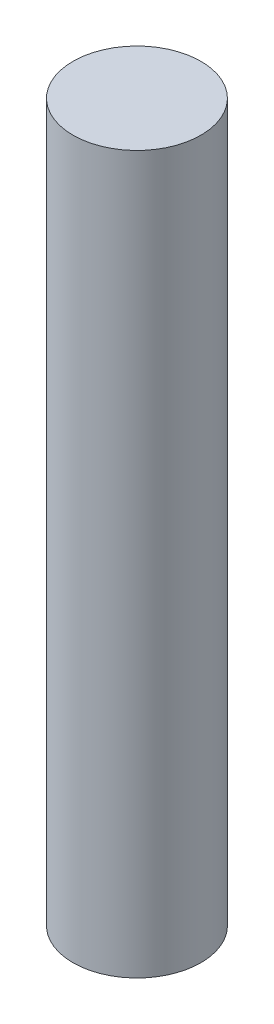
ISO-10303-21;
HEADER;
FILE_DESCRIPTION(('STEP AP214'),'2;1');
FILE_NAME('part.step','',(''),(''),'','','');
FILE_SCHEMA(('AUTOMOTIVE_DESIGN { 1 0 10303 214 1 1 1 1 }'));
ENDSEC;
DATA;
#1=APPLICATION_CONTEXT('core data for automotive mechanical design processes');
#2=APPLICATION_PROTOCOL_DEFINITION('international standard','automotive_design',2000,#1);
#3=PRODUCT_CONTEXT('',#1,'mechanical');
#4=PRODUCT('Part','Part','',(#3));
#5=PRODUCT_RELATED_PRODUCT_CATEGORY('part','',(#4));
#6=PRODUCT_DEFINITION_FORMATION('','',#4);
#7=PRODUCT_DEFINITION_CONTEXT('part definition',#1,'design');
#8=PRODUCT_DEFINITION('design','',#6,#7);
#9=PRODUCT_DEFINITION_SHAPE('','',#8);
#10=(LENGTH_UNIT() NAMED_UNIT(*) SI_UNIT(.MILLI.,.METRE.));
#11=(NAMED_UNIT(*) PLANE_ANGLE_UNIT() SI_UNIT($,.RADIAN.));
#12=(NAMED_UNIT(*) SI_UNIT($,.STERADIAN.) SOLID_ANGLE_UNIT());
#13=UNCERTAINTY_MEASURE_WITH_UNIT(LENGTH_MEASURE(1.E-05),#10,'distance_accuracy_value','');
#14=(GEOMETRIC_REPRESENTATION_CONTEXT(3) GLOBAL_UNCERTAINTY_ASSIGNED_CONTEXT((#13)) GLOBAL_UNIT_ASSIGNED_CONTEXT((#10,
#11,#12)) REPRESENTATION_CONTEXT('',''));
#15=CARTESIAN_POINT('',(0.,0.,0.));
#16=DIRECTION('',(0.,0.,1.));
#17=DIRECTION('',(1.,0.,0.));
#18=AXIS2_PLACEMENT_3D('',#15,#16,#17);
#19=CARTESIAN_POINT('',(0.,17.78,0.));
#20=DIRECTION('',(0.,-1.,0.));
#21=DIRECTION('',(0.,0.,-1.));
#22=AXIS2_PLACEMENT_3D('',#19,#20,#21);
#23=CYLINDRICAL_SURFACE('',#22,1.5875);
#24=CARTESIAN_POINT('',(0.,17.78,0.));
#25=DIRECTION('',(0.,1.,0.));
#26=DIRECTION('',(0.,0.,1.));
#27=AXIS2_PLACEMENT_3D('',#24,#25,#26);
#28=CIRCLE('',#27,1.5875);
#29=CARTESIAN_POINT('',(0.,17.78,1.5875));
#30=VERTEX_POINT('',#29);
#31=EDGE_CURVE('E10',#30,#30,#28,.T.);
#32=ORIENTED_EDGE('',*,*,#31,.F.);
#33=EDGE_LOOP('',(#32));
#34=FACE_BOUND('',#33,.T.);
#35=CARTESIAN_POINT('',(0.,0.,0.));
#36=DIRECTION('',(0.,1.,0.));
#37=DIRECTION('',(0.,0.,1.));
#38=AXIS2_PLACEMENT_3D('',#35,#36,#37);
#39=CIRCLE('',#38,1.5875);
#40=CARTESIAN_POINT('',(0.,0.,1.5875));
#41=VERTEX_POINT('',#40);
#42=EDGE_CURVE('E34',#41,#41,#39,.T.);
#43=ORIENTED_EDGE('',*,*,#42,.T.);
#44=EDGE_LOOP('',(#43));
#45=FACE_BOUND('',#44,.T.);
#46=ADVANCED_FACE('F31',(#34,#45),#23,.T.);
#47=CARTESIAN_POINT('',(0.,17.78,0.));
#48=DIRECTION('',(0.,1.,0.));
#49=DIRECTION('',(0.,0.,1.));
#50=AXIS2_PLACEMENT_3D('',#47,#48,#49);
#51=PLANE('',#50);
#52=ORIENTED_EDGE('',*,*,#31,.T.);
#53=EDGE_LOOP('',(#52));
#54=FACE_BOUND('',#53,.T.);
#55=ADVANCED_FACE('F46',(#54),#51,.T.);
#56=CARTESIAN_POINT('',(0.,0.,0.));
#57=DIRECTION('',(0.,1.,0.));
#58=DIRECTION('',(0.,0.,1.));
#59=AXIS2_PLACEMENT_3D('',#56,#57,#58);
#60=PLANE('',#59);
#61=ORIENTED_EDGE('',*,*,#42,.F.);
#62=EDGE_LOOP('',(#61));
#63=FACE_BOUND('',#62,.T.);
#64=ADVANCED_FACE('F44',(#63),#60,.F.);
#65=CLOSED_SHELL('',(#46,#55,#64));
#66=MANIFOLD_SOLID_BREP('B2',#65);
#67=ADVANCED_BREP_SHAPE_REPRESENTATION('',(#18,#66),#14);
#68=SHAPE_DEFINITION_REPRESENTATION(#9,#67);
ENDSEC;
END-ISO-10303-21;
